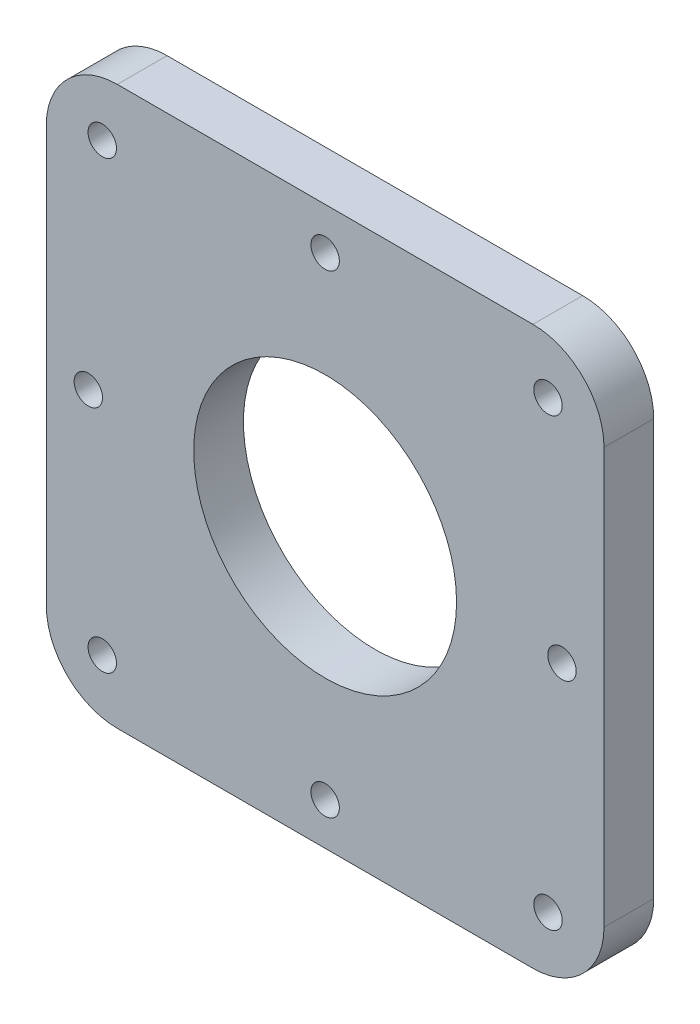
ISO-10303-21;
HEADER;
FILE_DESCRIPTION(('STEP AP214'),'2;1');
FILE_NAME('part.step','',(''),(''),'','','');
FILE_SCHEMA(('AUTOMOTIVE_DESIGN { 1 0 10303 214 1 1 1 1 }'));
ENDSEC;
DATA;
#1=APPLICATION_CONTEXT('core data for automotive mechanical design processes');
#2=APPLICATION_PROTOCOL_DEFINITION('international standard','automotive_design',2000,#1);
#3=PRODUCT_CONTEXT('',#1,'mechanical');
#4=PRODUCT('Part','Part','',(#3));
#5=PRODUCT_RELATED_PRODUCT_CATEGORY('part','',(#4));
#6=PRODUCT_DEFINITION_FORMATION('','',#4);
#7=PRODUCT_DEFINITION_CONTEXT('part definition',#1,'design');
#8=PRODUCT_DEFINITION('design','',#6,#7);
#9=PRODUCT_DEFINITION_SHAPE('','',#8);
#10=(LENGTH_UNIT() NAMED_UNIT(*) SI_UNIT(.MILLI.,.METRE.));
#11=(NAMED_UNIT(*) PLANE_ANGLE_UNIT() SI_UNIT($,.RADIAN.));
#12=(NAMED_UNIT(*) SI_UNIT($,.STERADIAN.) SOLID_ANGLE_UNIT());
#13=UNCERTAINTY_MEASURE_WITH_UNIT(LENGTH_MEASURE(1.E-05),#10,'distance_accuracy_value','');
#14=(GEOMETRIC_REPRESENTATION_CONTEXT(3) GLOBAL_UNCERTAINTY_ASSIGNED_CONTEXT((#13)) GLOBAL_UNIT_ASSIGNED_CONTEXT((#10,
#11,#12)) REPRESENTATION_CONTEXT('',''));
#15=CARTESIAN_POINT('',(0.,0.,0.));
#16=DIRECTION('',(0.,0.,1.));
#17=DIRECTION('',(1.,0.,0.));
#18=AXIS2_PLACEMENT_3D('',#15,#16,#17);
#19=CARTESIAN_POINT('',(39.25,-39.25,3.5));
#20=DIRECTION('',(-1.,0.,0.));
#21=DIRECTION('',(0.,0.,1.));
#22=AXIS2_PLACEMENT_3D('',#19,#20,#21);
#23=PLANE('',#22);
#24=DIRECTION('',(0.,1.,0.));
#25=VECTOR('',#24,1.);
#26=CARTESIAN_POINT('',(39.25,-39.25,3.5));
#27=LINE('',#26,#25);
#28=CARTESIAN_POINT('',(39.25,-29.25,3.5));
#29=VERTEX_POINT('',#28);
#30=CARTESIAN_POINT('',(39.25,29.25,3.5));
#31=VERTEX_POINT('',#30);
#32=EDGE_CURVE('E139',#29,#31,#27,.T.);
#33=ORIENTED_EDGE('',*,*,#32,.F.);
#34=DIRECTION('',(0.,0.,-1.));
#35=VECTOR('',#34,1.);
#36=CARTESIAN_POINT('',(39.25,-29.25,3.5));
#37=LINE('',#36,#35);
#38=CARTESIAN_POINT('',(39.25,-29.25,-3.5));
#39=VERTEX_POINT('',#38);
#40=EDGE_CURVE('E178',#29,#39,#37,.T.);
#41=ORIENTED_EDGE('',*,*,#40,.T.);
#42=DIRECTION('',(0.,1.,0.));
#43=VECTOR('',#42,1.);
#44=CARTESIAN_POINT('',(39.25,-39.25,-3.5));
#45=LINE('',#44,#43);
#46=CARTESIAN_POINT('',(39.25,29.25,-3.5));
#47=VERTEX_POINT('',#46);
#48=EDGE_CURVE('E193',#39,#47,#45,.T.);
#49=ORIENTED_EDGE('',*,*,#48,.T.);
#50=DIRECTION('',(0.,0.,-1.));
#51=VECTOR('',#50,1.);
#52=CARTESIAN_POINT('',(39.25,29.25,3.5));
#53=LINE('',#52,#51);
#54=EDGE_CURVE('E175',#47,#31,#53,.F.);
#55=ORIENTED_EDGE('',*,*,#54,.T.);
#56=EDGE_LOOP('',(#33,#41,#49,#55));
#57=FACE_BOUND('',#56,.T.);
#58=ADVANCED_FACE('F43',(#57),#23,.F.);
#59=CARTESIAN_POINT('',(-39.25,39.25,3.5));
#60=DIRECTION('',(0.,-1.,0.));
#61=DIRECTION('',(0.,0.,-1.));
#62=AXIS2_PLACEMENT_3D('',#59,#60,#61);
#63=PLANE('',#62);
#64=DIRECTION('',(-1.,0.,0.));
#65=VECTOR('',#64,1.);
#66=CARTESIAN_POINT('',(-39.25,39.25,3.5));
#67=LINE('',#66,#65);
#68=CARTESIAN_POINT('',(29.25,39.25,3.5));
#69=VERTEX_POINT('',#68);
#70=CARTESIAN_POINT('',(-29.25,39.25,3.5));
#71=VERTEX_POINT('',#70);
#72=EDGE_CURVE('E144',#69,#71,#67,.T.);
#73=ORIENTED_EDGE('',*,*,#72,.F.);
#74=DIRECTION('',(0.,0.,-1.));
#75=VECTOR('',#74,1.);
#76=CARTESIAN_POINT('',(29.25,39.25,3.5));
#77=LINE('',#76,#75);
#78=CARTESIAN_POINT('',(29.25,39.25,-3.5));
#79=VERTEX_POINT('',#78);
#80=EDGE_CURVE('E11',#69,#79,#77,.T.);
#81=ORIENTED_EDGE('',*,*,#80,.T.);
#82=DIRECTION('',(-1.,0.,0.));
#83=VECTOR('',#82,1.);
#84=CARTESIAN_POINT('',(-39.25,39.25,-3.5));
#85=LINE('',#84,#83);
#86=CARTESIAN_POINT('',(-29.25,39.25,-3.5));
#87=VERTEX_POINT('',#86);
#88=EDGE_CURVE('E146',#79,#87,#85,.T.);
#89=ORIENTED_EDGE('',*,*,#88,.T.);
#90=DIRECTION('',(0.,0.,-1.));
#91=VECTOR('',#90,1.);
#92=CARTESIAN_POINT('',(-29.25,39.25,3.5));
#93=LINE('',#92,#91);
#94=EDGE_CURVE('E52',#87,#71,#93,.F.);
#95=ORIENTED_EDGE('',*,*,#94,.T.);
#96=EDGE_LOOP('',(#73,#81,#89,#95));
#97=FACE_BOUND('',#96,.T.);
#98=ADVANCED_FACE('F199',(#97),#63,.F.);
#99=CARTESIAN_POINT('',(-39.25,-39.25,3.5));
#100=DIRECTION('',(1.,0.,0.));
#101=DIRECTION('',(0.,0.,-1.));
#102=AXIS2_PLACEMENT_3D('',#99,#100,#101);
#103=PLANE('',#102);
#104=DIRECTION('',(0.,-1.,0.));
#105=VECTOR('',#104,1.);
#106=CARTESIAN_POINT('',(-39.25,-39.25,-3.5));
#107=LINE('',#106,#105);
#108=CARTESIAN_POINT('',(-39.25,29.25,-3.5));
#109=VERTEX_POINT('',#108);
#110=CARTESIAN_POINT('',(-39.25,-29.25,-3.5));
#111=VERTEX_POINT('',#110);
#112=EDGE_CURVE('E140',#109,#111,#107,.T.);
#113=ORIENTED_EDGE('',*,*,#112,.T.);
#114=DIRECTION('',(0.,0.,-1.));
#115=VECTOR('',#114,1.);
#116=CARTESIAN_POINT('',(-39.25,-29.25,3.5));
#117=LINE('',#116,#115);
#118=CARTESIAN_POINT('',(-39.25,-29.25,3.5));
#119=VERTEX_POINT('',#118);
#120=EDGE_CURVE('E115',#111,#119,#117,.F.);
#121=ORIENTED_EDGE('',*,*,#120,.T.);
#122=DIRECTION('',(0.,-1.,0.));
#123=VECTOR('',#122,1.);
#124=CARTESIAN_POINT('',(-39.25,-39.25,3.5));
#125=LINE('',#124,#123);
#126=CARTESIAN_POINT('',(-39.25,29.25,3.5));
#127=VERTEX_POINT('',#126);
#128=EDGE_CURVE('E184',#127,#119,#125,.T.);
#129=ORIENTED_EDGE('',*,*,#128,.F.);
#130=DIRECTION('',(0.,0.,-1.));
#131=VECTOR('',#130,1.);
#132=CARTESIAN_POINT('',(-39.25,29.25,3.5));
#133=LINE('',#132,#131);
#134=EDGE_CURVE('E121',#127,#109,#133,.T.);
#135=ORIENTED_EDGE('',*,*,#134,.T.);
#136=EDGE_LOOP('',(#113,#121,#129,#135));
#137=FACE_BOUND('',#136,.T.);
#138=ADVANCED_FACE('F206',(#137),#103,.F.);
#139=CARTESIAN_POINT('',(-39.25,-39.25,3.5));
#140=DIRECTION('',(0.,1.,0.));
#141=DIRECTION('',(0.,0.,1.));
#142=AXIS2_PLACEMENT_3D('',#139,#140,#141);
#143=PLANE('',#142);
#144=DIRECTION('',(1.,0.,0.));
#145=VECTOR('',#144,1.);
#146=CARTESIAN_POINT('',(-39.25,-39.25,3.5));
#147=LINE('',#146,#145);
#148=CARTESIAN_POINT('',(-29.25,-39.25,3.5));
#149=VERTEX_POINT('',#148);
#150=CARTESIAN_POINT('',(29.25,-39.25,3.5));
#151=VERTEX_POINT('',#150);
#152=EDGE_CURVE('E131',#149,#151,#147,.T.);
#153=ORIENTED_EDGE('',*,*,#152,.F.);
#154=DIRECTION('',(0.,0.,-1.));
#155=VECTOR('',#154,1.);
#156=CARTESIAN_POINT('',(-29.25,-39.25,3.5));
#157=LINE('',#156,#155);
#158=CARTESIAN_POINT('',(-29.25,-39.25,-3.5));
#159=VERTEX_POINT('',#158);
#160=EDGE_CURVE('E114',#149,#159,#157,.T.);
#161=ORIENTED_EDGE('',*,*,#160,.T.);
#162=DIRECTION('',(1.,0.,0.));
#163=VECTOR('',#162,1.);
#164=CARTESIAN_POINT('',(-39.25,-39.25,-3.5));
#165=LINE('',#164,#163);
#166=CARTESIAN_POINT('',(29.25,-39.25,-3.5));
#167=VERTEX_POINT('',#166);
#168=EDGE_CURVE('E128',#159,#167,#165,.T.);
#169=ORIENTED_EDGE('',*,*,#168,.T.);
#170=DIRECTION('',(0.,0.,-1.));
#171=VECTOR('',#170,1.);
#172=CARTESIAN_POINT('',(29.25,-39.25,3.5));
#173=LINE('',#172,#171);
#174=EDGE_CURVE('E134',#167,#151,#173,.F.);
#175=ORIENTED_EDGE('',*,*,#174,.T.);
#176=EDGE_LOOP('',(#153,#161,#169,#175));
#177=FACE_BOUND('',#176,.T.);
#178=ADVANCED_FACE('F127',(#177),#143,.F.);
#179=CARTESIAN_POINT('',(0.,0.,3.5));
#180=DIRECTION('',(0.,0.,-1.));
#181=DIRECTION('',(-1.,0.,0.));
#182=AXIS2_PLACEMENT_3D('',#179,#180,#181);
#183=PLANE('',#182);
#184=CARTESIAN_POINT('',(0.,33.3330136651338,3.5));
#185=DIRECTION('',(0.,0.,1.));
#186=DIRECTION('',(1.,0.,0.));
#187=AXIS2_PLACEMENT_3D('',#184,#185,#186);
#188=CIRCLE('',#187,2.00000000000001);
#189=CARTESIAN_POINT('',(2.00000000000001,33.3330136651338,3.5));
#190=VERTEX_POINT('',#189);
#191=EDGE_CURVE('E342',#190,#190,#188,.T.);
#192=ORIENTED_EDGE('',*,*,#191,.F.);
#193=EDGE_LOOP('',(#192));
#194=FACE_BOUND('',#193,.T.);
#195=CARTESIAN_POINT('',(-33.3330136651338,0.,3.5));
#196=DIRECTION('',(0.,0.,1.));
#197=DIRECTION('',(1.,0.,0.));
#198=AXIS2_PLACEMENT_3D('',#195,#196,#197);
#199=CIRCLE('',#198,2.00000000000001);
#200=CARTESIAN_POINT('',(-31.3330136651338,0.,3.5));
#201=VERTEX_POINT('',#200);
#202=EDGE_CURVE('E338',#201,#201,#199,.T.);
#203=ORIENTED_EDGE('',*,*,#202,.F.);
#204=EDGE_LOOP('',(#203));
#205=FACE_BOUND('',#204,.T.);
#206=CARTESIAN_POINT('',(0.,-33.3330136651338,3.5));
#207=DIRECTION('',(0.,0.,1.));
#208=DIRECTION('',(1.,0.,0.));
#209=AXIS2_PLACEMENT_3D('',#206,#207,#208);
#210=CIRCLE('',#209,2.00000000000001);
#211=CARTESIAN_POINT('',(2.00000000000001,-33.3330136651338,3.5));
#212=VERTEX_POINT('',#211);
#213=EDGE_CURVE('E332',#212,#212,#210,.T.);
#214=ORIENTED_EDGE('',*,*,#213,.F.);
#215=EDGE_LOOP('',(#214));
#216=FACE_BOUND('',#215,.T.);
#217=CARTESIAN_POINT('',(33.3330136651338,0.,3.5));
#218=DIRECTION('',(0.,0.,1.));
#219=DIRECTION('',(1.,0.,0.));
#220=AXIS2_PLACEMENT_3D('',#217,#218,#219);
#221=CIRCLE('',#220,2.00000000000001);
#222=CARTESIAN_POINT('',(35.3330136651339,0.,3.5));
#223=VERTEX_POINT('',#222);
#224=EDGE_CURVE('E326',#223,#223,#221,.T.);
#225=ORIENTED_EDGE('',*,*,#224,.F.);
#226=EDGE_LOOP('',(#225));
#227=FACE_BOUND('',#226,.T.);
#228=CARTESIAN_POINT('',(0.,0.,3.5));
#229=DIRECTION('',(0.,0.,1.));
#230=DIRECTION('',(1.,0.,0.));
#231=AXIS2_PLACEMENT_3D('',#228,#229,#230);
#232=CIRCLE('',#231,18.5);
#233=CARTESIAN_POINT('',(18.5,0.,3.5));
#234=VERTEX_POINT('',#233);
#235=EDGE_CURVE('E318',#234,#234,#232,.T.);
#236=ORIENTED_EDGE('',*,*,#235,.F.);
#237=EDGE_LOOP('',(#236));
#238=FACE_BOUND('',#237,.T.);
#239=CARTESIAN_POINT('',(-31.3713203435598,-31.3713203435595,3.5));
#240=DIRECTION('',(0.,0.,1.));
#241=DIRECTION('',(-1.,0.,0.));
#242=AXIS2_PLACEMENT_3D('',#239,#240,#241);
#243=CIRCLE('',#242,2.);
#244=CARTESIAN_POINT('',(-33.3713203435598,-31.3713203435595,3.5));
#245=VERTEX_POINT('',#244);
#246=EDGE_CURVE('E299',#245,#245,#243,.T.);
#247=ORIENTED_EDGE('',*,*,#246,.F.);
#248=EDGE_LOOP('',(#247));
#249=FACE_BOUND('',#248,.T.);
#250=CARTESIAN_POINT('',(31.3713203435598,31.3713203435595,3.5));
#251=DIRECTION('',(0.,0.,1.));
#252=DIRECTION('',(-1.,0.,0.));
#253=AXIS2_PLACEMENT_3D('',#250,#251,#252);
#254=CIRCLE('',#253,2.);
#255=CARTESIAN_POINT('',(29.3713203435598,31.3713203435595,3.5));
#256=VERTEX_POINT('',#255);
#257=EDGE_CURVE('E303',#256,#256,#254,.T.);
#258=ORIENTED_EDGE('',*,*,#257,.F.);
#259=EDGE_LOOP('',(#258));
#260=FACE_BOUND('',#259,.T.);
#261=CARTESIAN_POINT('',(31.3713203435598,-31.3713203435595,3.5));
#262=DIRECTION('',(0.,0.,1.));
#263=DIRECTION('',(1.,0.,0.));
#264=AXIS2_PLACEMENT_3D('',#261,#262,#263);
#265=CIRCLE('',#264,2.);
#266=CARTESIAN_POINT('',(33.3713203435598,-31.3713203435595,3.5));
#267=VERTEX_POINT('',#266);
#268=EDGE_CURVE('E304',#267,#267,#265,.T.);
#269=ORIENTED_EDGE('',*,*,#268,.F.);
#270=EDGE_LOOP('',(#269));
#271=FACE_BOUND('',#270,.T.);
#272=CARTESIAN_POINT('',(-31.3713203435598,31.3713203435595,3.5));
#273=DIRECTION('',(0.,0.,1.));
#274=DIRECTION('',(1.,0.,0.));
#275=AXIS2_PLACEMENT_3D('',#272,#273,#274);
#276=CIRCLE('',#275,2.);
#277=CARTESIAN_POINT('',(-29.3713203435598,31.3713203435595,3.5));
#278=VERTEX_POINT('',#277);
#279=EDGE_CURVE('E295',#278,#278,#276,.T.);
#280=ORIENTED_EDGE('',*,*,#279,.F.);
#281=EDGE_LOOP('',(#280));
#282=FACE_BOUND('',#281,.T.);
#283=ORIENTED_EDGE('',*,*,#128,.T.);
#284=CARTESIAN_POINT('',(-29.25,-29.25,3.5));
#285=DIRECTION('',(0.,0.,-1.));
#286=DIRECTION('',(-1.,0.,0.));
#287=AXIS2_PLACEMENT_3D('',#284,#285,#286);
#288=CIRCLE('',#287,10.);
#289=EDGE_CURVE('E172',#119,#149,#288,.F.);
#290=ORIENTED_EDGE('',*,*,#289,.T.);
#291=ORIENTED_EDGE('',*,*,#152,.T.);
#292=CARTESIAN_POINT('',(29.25,-29.25,3.5));
#293=DIRECTION('',(0.,0.,-1.));
#294=DIRECTION('',(-1.,0.,0.));
#295=AXIS2_PLACEMENT_3D('',#292,#293,#294);
#296=CIRCLE('',#295,10.);
#297=EDGE_CURVE('E169',#151,#29,#296,.F.);
#298=ORIENTED_EDGE('',*,*,#297,.T.);
#299=ORIENTED_EDGE('',*,*,#32,.T.);
#300=CARTESIAN_POINT('',(29.25,29.25,3.5));
#301=DIRECTION('',(0.,0.,-1.));
#302=DIRECTION('',(-1.,0.,0.));
#303=AXIS2_PLACEMENT_3D('',#300,#301,#302);
#304=CIRCLE('',#303,10.);
#305=EDGE_CURVE('E65',#31,#69,#304,.F.);
#306=ORIENTED_EDGE('',*,*,#305,.T.);
#307=ORIENTED_EDGE('',*,*,#72,.T.);
#308=CARTESIAN_POINT('',(-29.25,29.25,3.5));
#309=DIRECTION('',(0.,0.,-1.));
#310=DIRECTION('',(-1.,0.,0.));
#311=AXIS2_PLACEMENT_3D('',#308,#309,#310);
#312=CIRCLE('',#311,10.);
#313=EDGE_CURVE('E164',#71,#127,#312,.F.);
#314=ORIENTED_EDGE('',*,*,#313,.T.);
#315=EDGE_LOOP('',(#283,#290,#291,#298,#299,#306,#307,#314));
#316=FACE_BOUND('',#315,.T.);
#317=ADVANCED_FACE('F204',(#194,#205,#216,#227,#238,#249,#260,#271,#282,#316),#183,.F.);
#318=CARTESIAN_POINT('',(0.,0.,-3.5));
#319=DIRECTION('',(0.,0.,-1.));
#320=DIRECTION('',(-1.,0.,0.));
#321=AXIS2_PLACEMENT_3D('',#318,#319,#320);
#322=PLANE('',#321);
#323=CARTESIAN_POINT('',(0.,33.3330136651338,-3.5));
#324=DIRECTION('',(0.,0.,1.));
#325=DIRECTION('',(1.,0.,0.));
#326=AXIS2_PLACEMENT_3D('',#323,#324,#325);
#327=CIRCLE('',#326,2.00000000000001);
#328=CARTESIAN_POINT('',(2.00000000000001,33.3330136651338,-3.5));
#329=VERTEX_POINT('',#328);
#330=EDGE_CURVE('E264',#329,#329,#327,.T.);
#331=ORIENTED_EDGE('',*,*,#330,.T.);
#332=EDGE_LOOP('',(#331));
#333=FACE_BOUND('',#332,.T.);
#334=CARTESIAN_POINT('',(-33.3330136651338,0.,-3.5));
#335=DIRECTION('',(0.,0.,1.));
#336=DIRECTION('',(1.,0.,0.));
#337=AXIS2_PLACEMENT_3D('',#334,#335,#336);
#338=CIRCLE('',#337,2.00000000000001);
#339=CARTESIAN_POINT('',(-31.3330136651338,0.,-3.5));
#340=VERTEX_POINT('',#339);
#341=EDGE_CURVE('E268',#340,#340,#338,.T.);
#342=ORIENTED_EDGE('',*,*,#341,.T.);
#343=EDGE_LOOP('',(#342));
#344=FACE_BOUND('',#343,.T.);
#345=CARTESIAN_POINT('',(0.,-33.3330136651338,-3.5));
#346=DIRECTION('',(0.,0.,1.));
#347=DIRECTION('',(1.,0.,0.));
#348=AXIS2_PLACEMENT_3D('',#345,#346,#347);
#349=CIRCLE('',#348,2.00000000000001);
#350=CARTESIAN_POINT('',(2.00000000000001,-33.3330136651338,-3.5));
#351=VERTEX_POINT('',#350);
#352=EDGE_CURVE('E272',#351,#351,#349,.T.);
#353=ORIENTED_EDGE('',*,*,#352,.T.);
#354=EDGE_LOOP('',(#353));
#355=FACE_BOUND('',#354,.T.);
#356=CARTESIAN_POINT('',(33.3330136651338,0.,-3.5));
#357=DIRECTION('',(0.,0.,1.));
#358=DIRECTION('',(1.,0.,0.));
#359=AXIS2_PLACEMENT_3D('',#356,#357,#358);
#360=CIRCLE('',#359,2.00000000000001);
#361=CARTESIAN_POINT('',(35.3330136651339,0.,-3.5));
#362=VERTEX_POINT('',#361);
#363=EDGE_CURVE('E276',#362,#362,#360,.T.);
#364=ORIENTED_EDGE('',*,*,#363,.T.);
#365=EDGE_LOOP('',(#364));
#366=FACE_BOUND('',#365,.T.);
#367=CARTESIAN_POINT('',(0.,0.,-3.5));
#368=DIRECTION('',(0.,0.,1.));
#369=DIRECTION('',(1.,0.,0.));
#370=AXIS2_PLACEMENT_3D('',#367,#368,#369);
#371=CIRCLE('',#370,18.5);
#372=CARTESIAN_POINT('',(18.5,0.,-3.5));
#373=VERTEX_POINT('',#372);
#374=EDGE_CURVE('E280',#373,#373,#371,.T.);
#375=ORIENTED_EDGE('',*,*,#374,.T.);
#376=EDGE_LOOP('',(#375));
#377=FACE_BOUND('',#376,.T.);
#378=CARTESIAN_POINT('',(-31.3713203435598,-31.3713203435595,-3.5));
#379=DIRECTION('',(0.,0.,1.));
#380=DIRECTION('',(-1.,0.,0.));
#381=AXIS2_PLACEMENT_3D('',#378,#379,#380);
#382=CIRCLE('',#381,2.);
#383=CARTESIAN_POINT('',(-33.3713203435598,-31.3713203435595,-3.5));
#384=VERTEX_POINT('',#383);
#385=EDGE_CURVE('E284',#384,#384,#382,.T.);
#386=ORIENTED_EDGE('',*,*,#385,.T.);
#387=EDGE_LOOP('',(#386));
#388=FACE_BOUND('',#387,.T.);
#389=CARTESIAN_POINT('',(31.3713203435598,31.3713203435595,-3.5));
#390=DIRECTION('',(0.,0.,1.));
#391=DIRECTION('',(-1.,0.,0.));
#392=AXIS2_PLACEMENT_3D('',#389,#390,#391);
#393=CIRCLE('',#392,2.);
#394=CARTESIAN_POINT('',(29.3713203435598,31.3713203435595,-3.5));
#395=VERTEX_POINT('',#394);
#396=EDGE_CURVE('E288',#395,#395,#393,.T.);
#397=ORIENTED_EDGE('',*,*,#396,.T.);
#398=EDGE_LOOP('',(#397));
#399=FACE_BOUND('',#398,.T.);
#400=CARTESIAN_POINT('',(31.3713203435598,-31.3713203435595,-3.5));
#401=DIRECTION('',(0.,0.,1.));
#402=DIRECTION('',(1.,0.,0.));
#403=AXIS2_PLACEMENT_3D('',#400,#401,#402);
#404=CIRCLE('',#403,2.);
#405=CARTESIAN_POINT('',(33.3713203435598,-31.3713203435595,-3.5));
#406=VERTEX_POINT('',#405);
#407=EDGE_CURVE('E292',#406,#406,#404,.T.);
#408=ORIENTED_EDGE('',*,*,#407,.T.);
#409=EDGE_LOOP('',(#408));
#410=FACE_BOUND('',#409,.T.);
#411=CARTESIAN_POINT('',(-31.3713203435598,31.3713203435595,-3.5));
#412=DIRECTION('',(0.,0.,1.));
#413=DIRECTION('',(1.,0.,0.));
#414=AXIS2_PLACEMENT_3D('',#411,#412,#413);
#415=CIRCLE('',#414,2.);
#416=CARTESIAN_POINT('',(-29.3713203435598,31.3713203435595,-3.5));
#417=VERTEX_POINT('',#416);
#418=EDGE_CURVE('E196',#417,#417,#415,.T.);
#419=ORIENTED_EDGE('',*,*,#418,.T.);
#420=EDGE_LOOP('',(#419));
#421=FACE_BOUND('',#420,.T.);
#422=ORIENTED_EDGE('',*,*,#168,.F.);
#423=CARTESIAN_POINT('',(-29.25,-29.25,-3.5));
#424=DIRECTION('',(0.,0.,-1.));
#425=DIRECTION('',(-1.,0.,0.));
#426=AXIS2_PLACEMENT_3D('',#423,#424,#425);
#427=CIRCLE('',#426,10.);
#428=EDGE_CURVE('E110',#159,#111,#427,.T.);
#429=ORIENTED_EDGE('',*,*,#428,.T.);
#430=ORIENTED_EDGE('',*,*,#112,.F.);
#431=CARTESIAN_POINT('',(-29.25,29.25,-3.5));
#432=DIRECTION('',(0.,0.,-1.));
#433=DIRECTION('',(-1.,0.,0.));
#434=AXIS2_PLACEMENT_3D('',#431,#432,#433);
#435=CIRCLE('',#434,10.);
#436=EDGE_CURVE('E133',#109,#87,#435,.T.);
#437=ORIENTED_EDGE('',*,*,#436,.T.);
#438=ORIENTED_EDGE('',*,*,#88,.F.);
#439=CARTESIAN_POINT('',(29.25,29.25,-3.5));
#440=DIRECTION('',(0.,0.,-1.));
#441=DIRECTION('',(-1.,0.,0.));
#442=AXIS2_PLACEMENT_3D('',#439,#440,#441);
#443=CIRCLE('',#442,10.);
#444=EDGE_CURVE('E154',#79,#47,#443,.T.);
#445=ORIENTED_EDGE('',*,*,#444,.T.);
#446=ORIENTED_EDGE('',*,*,#48,.F.);
#447=CARTESIAN_POINT('',(29.25,-29.25,-3.5));
#448=DIRECTION('',(0.,0.,-1.));
#449=DIRECTION('',(-1.,0.,0.));
#450=AXIS2_PLACEMENT_3D('',#447,#448,#449);
#451=CIRCLE('',#450,10.);
#452=EDGE_CURVE('E122',#39,#167,#451,.T.);
#453=ORIENTED_EDGE('',*,*,#452,.T.);
#454=EDGE_LOOP('',(#422,#429,#430,#437,#438,#445,#446,#453));
#455=FACE_BOUND('',#454,.T.);
#456=ADVANCED_FACE('F136',(#333,#344,#355,#366,#377,#388,#399,#410,#421,#455),#322,.T.);
#457=CARTESIAN_POINT('',(-29.25,-29.25,3.5));
#458=DIRECTION('',(0.,0.,-1.));
#459=DIRECTION('',(-1.,0.,0.));
#460=AXIS2_PLACEMENT_3D('',#457,#458,#459);
#461=CYLINDRICAL_SURFACE('',#460,10.);
#462=ORIENTED_EDGE('',*,*,#289,.F.);
#463=ORIENTED_EDGE('',*,*,#120,.F.);
#464=ORIENTED_EDGE('',*,*,#428,.F.);
#465=ORIENTED_EDGE('',*,*,#160,.F.);
#466=EDGE_LOOP('',(#462,#463,#464,#465));
#467=FACE_BOUND('',#466,.T.);
#468=ADVANCED_FACE('F113',(#467),#461,.T.);
#469=CARTESIAN_POINT('',(29.25,-29.25,3.5));
#470=DIRECTION('',(0.,0.,-1.));
#471=DIRECTION('',(-1.,0.,0.));
#472=AXIS2_PLACEMENT_3D('',#469,#470,#471);
#473=CYLINDRICAL_SURFACE('',#472,10.);
#474=ORIENTED_EDGE('',*,*,#297,.F.);
#475=ORIENTED_EDGE('',*,*,#174,.F.);
#476=ORIENTED_EDGE('',*,*,#452,.F.);
#477=ORIENTED_EDGE('',*,*,#40,.F.);
#478=EDGE_LOOP('',(#474,#475,#476,#477));
#479=FACE_BOUND('',#478,.T.);
#480=ADVANCED_FACE('F224',(#479),#473,.T.);
#481=CARTESIAN_POINT('',(29.25,29.25,3.5));
#482=DIRECTION('',(0.,0.,-1.));
#483=DIRECTION('',(-1.,0.,0.));
#484=AXIS2_PLACEMENT_3D('',#481,#482,#483);
#485=CYLINDRICAL_SURFACE('',#484,10.);
#486=ORIENTED_EDGE('',*,*,#305,.F.);
#487=ORIENTED_EDGE('',*,*,#54,.F.);
#488=ORIENTED_EDGE('',*,*,#444,.F.);
#489=ORIENTED_EDGE('',*,*,#80,.F.);
#490=EDGE_LOOP('',(#486,#487,#488,#489));
#491=FACE_BOUND('',#490,.T.);
#492=ADVANCED_FACE('F226',(#491),#485,.T.);
#493=CARTESIAN_POINT('',(-29.25,29.25,3.5));
#494=DIRECTION('',(0.,0.,-1.));
#495=DIRECTION('',(-1.,0.,0.));
#496=AXIS2_PLACEMENT_3D('',#493,#494,#495);
#497=CYLINDRICAL_SURFACE('',#496,10.);
#498=ORIENTED_EDGE('',*,*,#313,.F.);
#499=ORIENTED_EDGE('',*,*,#94,.F.);
#500=ORIENTED_EDGE('',*,*,#436,.F.);
#501=ORIENTED_EDGE('',*,*,#134,.F.);
#502=EDGE_LOOP('',(#498,#499,#500,#501));
#503=FACE_BOUND('',#502,.T.);
#504=ADVANCED_FACE('F45',(#503),#497,.T.);
#505=CARTESIAN_POINT('',(-31.3713203435598,31.3713203435595,-3.5));
#506=DIRECTION('',(0.,0.,1.));
#507=DIRECTION('',(1.,0.,0.));
#508=AXIS2_PLACEMENT_3D('',#505,#506,#507);
#509=CYLINDRICAL_SURFACE('',#508,2.);
#510=ORIENTED_EDGE('',*,*,#418,.F.);
#511=EDGE_LOOP('',(#510));
#512=FACE_BOUND('',#511,.T.);
#513=ORIENTED_EDGE('',*,*,#279,.T.);
#514=EDGE_LOOP('',(#513));
#515=FACE_BOUND('',#514,.T.);
#516=ADVANCED_FACE('F233',(#512,#515),#509,.F.);
#517=CARTESIAN_POINT('',(31.3713203435598,-31.3713203435595,-3.5));
#518=DIRECTION('',(0.,0.,1.));
#519=DIRECTION('',(1.,0.,0.));
#520=AXIS2_PLACEMENT_3D('',#517,#518,#519);
#521=CYLINDRICAL_SURFACE('',#520,2.);
#522=ORIENTED_EDGE('',*,*,#407,.F.);
#523=EDGE_LOOP('',(#522));
#524=FACE_BOUND('',#523,.T.);
#525=ORIENTED_EDGE('',*,*,#268,.T.);
#526=EDGE_LOOP('',(#525));
#527=FACE_BOUND('',#526,.T.);
#528=ADVANCED_FACE('F240',(#524,#527),#521,.F.);
#529=CARTESIAN_POINT('',(31.3713203435598,31.3713203435595,-3.5));
#530=DIRECTION('',(0.,0.,1.));
#531=DIRECTION('',(1.,0.,0.));
#532=AXIS2_PLACEMENT_3D('',#529,#530,#531);
#533=CYLINDRICAL_SURFACE('',#532,2.);
#534=ORIENTED_EDGE('',*,*,#396,.F.);
#535=EDGE_LOOP('',(#534));
#536=FACE_BOUND('',#535,.T.);
#537=ORIENTED_EDGE('',*,*,#257,.T.);
#538=EDGE_LOOP('',(#537));
#539=FACE_BOUND('',#538,.T.);
#540=ADVANCED_FACE('F246',(#536,#539),#533,.F.);
#541=CARTESIAN_POINT('',(-31.3713203435598,-31.3713203435595,-3.5));
#542=DIRECTION('',(0.,0.,1.));
#543=DIRECTION('',(1.,0.,0.));
#544=AXIS2_PLACEMENT_3D('',#541,#542,#543);
#545=CYLINDRICAL_SURFACE('',#544,2.);
#546=ORIENTED_EDGE('',*,*,#385,.F.);
#547=EDGE_LOOP('',(#546));
#548=FACE_BOUND('',#547,.T.);
#549=ORIENTED_EDGE('',*,*,#246,.T.);
#550=EDGE_LOOP('',(#549));
#551=FACE_BOUND('',#550,.T.);
#552=ADVANCED_FACE('F369',(#548,#551),#545,.F.);
#553=CARTESIAN_POINT('',(0.,0.,-3.5));
#554=DIRECTION('',(0.,0.,1.));
#555=DIRECTION('',(1.,0.,0.));
#556=AXIS2_PLACEMENT_3D('',#553,#554,#555);
#557=CYLINDRICAL_SURFACE('',#556,18.5);
#558=ORIENTED_EDGE('',*,*,#374,.F.);
#559=EDGE_LOOP('',(#558));
#560=FACE_BOUND('',#559,.T.);
#561=ORIENTED_EDGE('',*,*,#235,.T.);
#562=EDGE_LOOP('',(#561));
#563=FACE_BOUND('',#562,.T.);
#564=ADVANCED_FACE('F374',(#560,#563),#557,.F.);
#565=CARTESIAN_POINT('',(33.3330136651338,0.,-3.5));
#566=DIRECTION('',(0.,0.,1.));
#567=DIRECTION('',(1.,0.,0.));
#568=AXIS2_PLACEMENT_3D('',#565,#566,#567);
#569=CYLINDRICAL_SURFACE('',#568,2.00000000000001);
#570=ORIENTED_EDGE('',*,*,#363,.F.);
#571=EDGE_LOOP('',(#570));
#572=FACE_BOUND('',#571,.T.);
#573=ORIENTED_EDGE('',*,*,#224,.T.);
#574=EDGE_LOOP('',(#573));
#575=FACE_BOUND('',#574,.T.);
#576=ADVANCED_FACE('F379',(#572,#575),#569,.F.);
#577=CARTESIAN_POINT('',(0.,-33.3330136651338,-3.5));
#578=DIRECTION('',(0.,0.,1.));
#579=DIRECTION('',(1.,0.,0.));
#580=AXIS2_PLACEMENT_3D('',#577,#578,#579);
#581=CYLINDRICAL_SURFACE('',#580,2.00000000000001);
#582=ORIENTED_EDGE('',*,*,#352,.F.);
#583=EDGE_LOOP('',(#582));
#584=FACE_BOUND('',#583,.T.);
#585=ORIENTED_EDGE('',*,*,#213,.T.);
#586=EDGE_LOOP('',(#585));
#587=FACE_BOUND('',#586,.T.);
#588=ADVANCED_FACE('F386',(#584,#587),#581,.F.);
#589=CARTESIAN_POINT('',(-33.3330136651338,0.,-3.5));
#590=DIRECTION('',(0.,0.,1.));
#591=DIRECTION('',(1.,0.,0.));
#592=AXIS2_PLACEMENT_3D('',#589,#590,#591);
#593=CYLINDRICAL_SURFACE('',#592,2.00000000000001);
#594=ORIENTED_EDGE('',*,*,#341,.F.);
#595=EDGE_LOOP('',(#594));
#596=FACE_BOUND('',#595,.T.);
#597=ORIENTED_EDGE('',*,*,#202,.T.);
#598=EDGE_LOOP('',(#597));
#599=FACE_BOUND('',#598,.T.);
#600=ADVANCED_FACE('F390',(#596,#599),#593,.F.);
#601=CARTESIAN_POINT('',(0.,33.3330136651338,-3.5));
#602=DIRECTION('',(0.,0.,1.));
#603=DIRECTION('',(1.,0.,0.));
#604=AXIS2_PLACEMENT_3D('',#601,#602,#603);
#605=CYLINDRICAL_SURFACE('',#604,2.00000000000001);
#606=ORIENTED_EDGE('',*,*,#330,.F.);
#607=EDGE_LOOP('',(#606));
#608=FACE_BOUND('',#607,.T.);
#609=ORIENTED_EDGE('',*,*,#191,.T.);
#610=EDGE_LOOP('',(#609));
#611=FACE_BOUND('',#610,.T.);
#612=ADVANCED_FACE('F349',(#608,#611),#605,.F.);
#613=CLOSED_SHELL('',(#58,#98,#138,#178,#317,#456,#468,#480,#492,#504,#516,#528,#540,#552,#564,
#576,#588,#600,#612));
#614=MANIFOLD_SOLID_BREP('B2',#613);
#615=ADVANCED_BREP_SHAPE_REPRESENTATION('',(#18,#614),#14);
#616=SHAPE_DEFINITION_REPRESENTATION(#9,#615);
ENDSEC;
END-ISO-10303-21;
